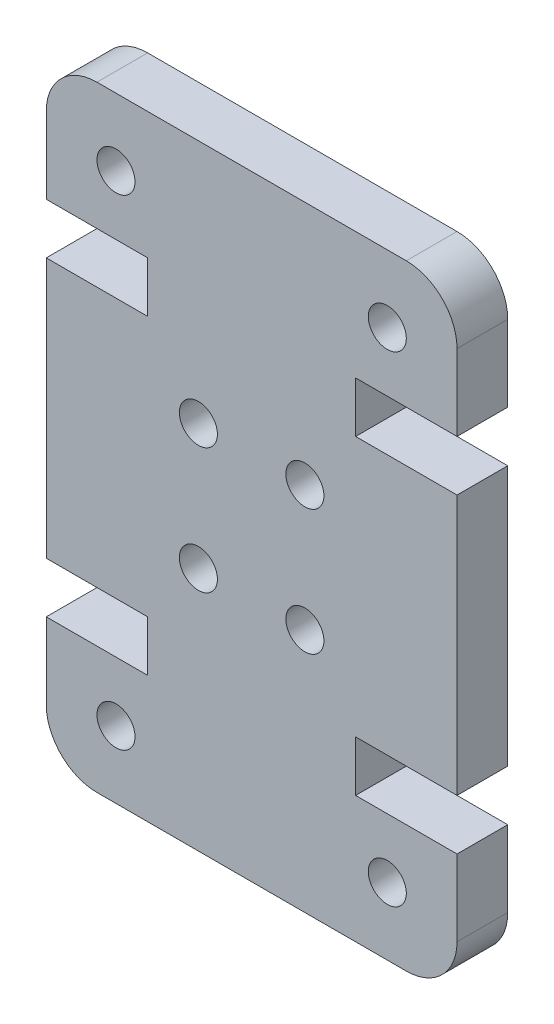
ISO-10303-21;
HEADER;
FILE_DESCRIPTION(('STEP AP214'),'2;1');
FILE_NAME('part.step','',(''),(''),'','','');
FILE_SCHEMA(('AUTOMOTIVE_DESIGN { 1 0 10303 214 1 1 1 1 }'));
ENDSEC;
DATA;
#1=APPLICATION_CONTEXT('core data for automotive mechanical design processes');
#2=APPLICATION_PROTOCOL_DEFINITION('international standard','automotive_design',2000,#1);
#3=PRODUCT_CONTEXT('',#1,'mechanical');
#4=PRODUCT('Part','Part','',(#3));
#5=PRODUCT_RELATED_PRODUCT_CATEGORY('part','',(#4));
#6=PRODUCT_DEFINITION_FORMATION('','',#4);
#7=PRODUCT_DEFINITION_CONTEXT('part definition',#1,'design');
#8=PRODUCT_DEFINITION('design','',#6,#7);
#9=PRODUCT_DEFINITION_SHAPE('','',#8);
#10=(LENGTH_UNIT() NAMED_UNIT(*) SI_UNIT(.MILLI.,.METRE.));
#11=(NAMED_UNIT(*) PLANE_ANGLE_UNIT() SI_UNIT($,.RADIAN.));
#12=(NAMED_UNIT(*) SI_UNIT($,.STERADIAN.) SOLID_ANGLE_UNIT());
#13=UNCERTAINTY_MEASURE_WITH_UNIT(LENGTH_MEASURE(1.E-05),#10,'distance_accuracy_value','');
#14=(GEOMETRIC_REPRESENTATION_CONTEXT(3) GLOBAL_UNCERTAINTY_ASSIGNED_CONTEXT((#13)) GLOBAL_UNIT_ASSIGNED_CONTEXT((#10,
#11,#12)) REPRESENTATION_CONTEXT('',''));
#15=CARTESIAN_POINT('',(0.,0.,0.));
#16=DIRECTION('',(0.,0.,1.));
#17=DIRECTION('',(1.,0.,0.));
#18=AXIS2_PLACEMENT_3D('',#15,#16,#17);
#19=CARTESIAN_POINT('',(14.2,2.,2.));
#20=DIRECTION('',(0.,0.,-1.));
#21=DIRECTION('',(-1.,0.,0.));
#22=AXIS2_PLACEMENT_3D('',#19,#20,#21);
#23=PLANE('',#22);
#24=CARTESIAN_POINT('',(6.00000000000001,9.65355116894447,2.));
#25=DIRECTION('',(0.,0.,1.));
#26=DIRECTION('',(1.,0.,0.));
#27=AXIS2_PLACEMENT_3D('',#24,#25,#26);
#28=CIRCLE('',#27,0.749999999999999);
#29=CARTESIAN_POINT('',(6.75,9.65355116894447,2.));
#30=VERTEX_POINT('',#29);
#31=EDGE_CURVE('E464',#30,#30,#28,.T.);
#32=ORIENTED_EDGE('',*,*,#31,.F.);
#33=EDGE_LOOP('',(#32));
#34=FACE_BOUND('',#33,.T.);
#35=CARTESIAN_POINT('',(10.2,14.6064488310555,2.));
#36=DIRECTION('',(0.,0.,1.));
#37=DIRECTION('',(1.,0.,0.));
#38=AXIS2_PLACEMENT_3D('',#35,#36,#37);
#39=CIRCLE('',#38,0.749999999999998);
#40=CARTESIAN_POINT('',(10.95,14.6064488310555,2.));
#41=VERTEX_POINT('',#40);
#42=EDGE_CURVE('E476',#41,#41,#39,.T.);
#43=ORIENTED_EDGE('',*,*,#42,.F.);
#44=EDGE_LOOP('',(#43));
#45=FACE_BOUND('',#44,.T.);
#46=CARTESIAN_POINT('',(2.75000000000003,21.606448831055,2.));
#47=DIRECTION('',(0.,0.,1.));
#48=DIRECTION('',(-1.,0.,0.));
#49=AXIS2_PLACEMENT_3D('',#46,#47,#48);
#50=CIRCLE('',#49,0.749999999999999);
#51=CARTESIAN_POINT('',(2.00000000000003,21.606448831055,2.));
#52=VERTEX_POINT('',#51);
#53=EDGE_CURVE('E488',#52,#52,#50,.T.);
#54=ORIENTED_EDGE('',*,*,#53,.F.);
#55=EDGE_LOOP('',(#54));
#56=FACE_BOUND('',#55,.T.);
#57=CARTESIAN_POINT('',(13.45,2.65355116894501,2.));
#58=DIRECTION('',(0.,0.,1.));
#59=DIRECTION('',(-1.,0.,0.));
#60=AXIS2_PLACEMENT_3D('',#57,#58,#59);
#61=CIRCLE('',#60,0.75);
#62=CARTESIAN_POINT('',(12.7,2.65355116894501,2.));
#63=VERTEX_POINT('',#62);
#64=EDGE_CURVE('E230',#63,#63,#61,.T.);
#65=ORIENTED_EDGE('',*,*,#64,.F.);
#66=EDGE_LOOP('',(#65));
#67=FACE_BOUND('',#66,.T.);
#68=CARTESIAN_POINT('',(14.2,2.,2.));
#69=DIRECTION('',(0.,0.,1.));
#70=DIRECTION('',(-1.,0.,0.));
#71=AXIS2_PLACEMENT_3D('',#68,#69,#70);
#72=CIRCLE('',#71,2.);
#73=CARTESIAN_POINT('',(14.2,0.,2.));
#74=VERTEX_POINT('',#73);
#75=CARTESIAN_POINT('',(16.2,2.,2.));
#76=VERTEX_POINT('',#75);
#77=EDGE_CURVE('E273',#74,#76,#72,.T.);
#78=ORIENTED_EDGE('',*,*,#77,.T.);
#79=DIRECTION('',(0.,1.,0.));
#80=VECTOR('',#79,1.);
#81=CARTESIAN_POINT('',(16.2,2.,2.));
#82=LINE('',#81,#80);
#83=CARTESIAN_POINT('',(16.2,4.99999999999945,2.));
#84=VERTEX_POINT('',#83);
#85=EDGE_CURVE('E141',#76,#84,#82,.T.);
#86=ORIENTED_EDGE('',*,*,#85,.T.);
#87=DIRECTION('',(-1.,0.,0.));
#88=VECTOR('',#87,1.);
#89=CARTESIAN_POINT('',(12.2,4.99999999999945,2.));
#90=LINE('',#89,#88);
#91=CARTESIAN_POINT('',(12.2,4.99999999999945,2.));
#92=VERTEX_POINT('',#91);
#93=EDGE_CURVE('E336',#84,#92,#90,.T.);
#94=ORIENTED_EDGE('',*,*,#93,.T.);
#95=DIRECTION('',(0.,1.,0.));
#96=VECTOR('',#95,1.);
#97=CARTESIAN_POINT('',(12.2,6.99999999999945,2.));
#98=LINE('',#97,#96);
#99=CARTESIAN_POINT('',(12.2,6.99999999999945,2.));
#100=VERTEX_POINT('',#99);
#101=EDGE_CURVE('E355',#92,#100,#98,.T.);
#102=ORIENTED_EDGE('',*,*,#101,.T.);
#103=DIRECTION('',(1.,0.,0.));
#104=VECTOR('',#103,1.);
#105=CARTESIAN_POINT('',(16.2,6.99999999999945,2.));
#106=LINE('',#105,#104);
#107=CARTESIAN_POINT('',(16.2,6.99999999999945,2.));
#108=VERTEX_POINT('',#107);
#109=EDGE_CURVE('E352',#100,#108,#106,.T.);
#110=ORIENTED_EDGE('',*,*,#109,.T.);
#111=DIRECTION('',(0.,1.,0.));
#112=VECTOR('',#111,1.);
#113=CARTESIAN_POINT('',(16.2,17.2600000000005,2.));
#114=LINE('',#113,#112);
#115=CARTESIAN_POINT('',(16.2,17.2600000000005,2.));
#116=VERTEX_POINT('',#115);
#117=EDGE_CURVE('E354',#108,#116,#114,.T.);
#118=ORIENTED_EDGE('',*,*,#117,.T.);
#119=DIRECTION('',(-1.,0.,0.));
#120=VECTOR('',#119,1.);
#121=CARTESIAN_POINT('',(16.2,17.2600000000005,2.));
#122=LINE('',#121,#120);
#123=CARTESIAN_POINT('',(12.2,17.2600000000005,2.));
#124=VERTEX_POINT('',#123);
#125=EDGE_CURVE('E357',#116,#124,#122,.T.);
#126=ORIENTED_EDGE('',*,*,#125,.T.);
#127=DIRECTION('',(0.,1.,0.));
#128=VECTOR('',#127,1.);
#129=CARTESIAN_POINT('',(12.2,17.2600000000005,2.));
#130=LINE('',#129,#128);
#131=CARTESIAN_POINT('',(12.2,19.2600000000005,2.));
#132=VERTEX_POINT('',#131);
#133=EDGE_CURVE('E363',#124,#132,#130,.T.);
#134=ORIENTED_EDGE('',*,*,#133,.T.);
#135=DIRECTION('',(1.,0.,0.));
#136=VECTOR('',#135,1.);
#137=CARTESIAN_POINT('',(12.2,19.2600000000005,2.));
#138=LINE('',#137,#136);
#139=CARTESIAN_POINT('',(16.2,19.2600000000005,2.));
#140=VERTEX_POINT('',#139);
#141=EDGE_CURVE('E365',#132,#140,#138,.T.);
#142=ORIENTED_EDGE('',*,*,#141,.T.);
#143=DIRECTION('',(0.,1.,0.));
#144=VECTOR('',#143,1.);
#145=CARTESIAN_POINT('',(16.2,22.26,2.));
#146=LINE('',#145,#144);
#147=CARTESIAN_POINT('',(16.2,22.26,2.));
#148=VERTEX_POINT('',#147);
#149=EDGE_CURVE('E367',#140,#148,#146,.T.);
#150=ORIENTED_EDGE('',*,*,#149,.T.);
#151=CARTESIAN_POINT('',(14.2,22.26,2.));
#152=DIRECTION('',(0.,0.,1.));
#153=DIRECTION('',(1.,0.,0.));
#154=AXIS2_PLACEMENT_3D('',#151,#152,#153);
#155=CIRCLE('',#154,2.);
#156=CARTESIAN_POINT('',(14.2,24.26,2.));
#157=VERTEX_POINT('',#156);
#158=EDGE_CURVE('E369',#148,#157,#155,.T.);
#159=ORIENTED_EDGE('',*,*,#158,.T.);
#160=DIRECTION('',(-1.,0.,0.));
#161=VECTOR('',#160,1.);
#162=CARTESIAN_POINT('',(1.99999999999999,24.26,2.));
#163=LINE('',#162,#161);
#164=CARTESIAN_POINT('',(1.99999999999999,24.26,2.));
#165=VERTEX_POINT('',#164);
#166=EDGE_CURVE('E371',#157,#165,#163,.T.);
#167=ORIENTED_EDGE('',*,*,#166,.T.);
#168=CARTESIAN_POINT('',(2.,22.26,2.));
#169=DIRECTION('',(0.,0.,1.));
#170=DIRECTION('',(-1.,0.,0.));
#171=AXIS2_PLACEMENT_3D('',#168,#169,#170);
#172=CIRCLE('',#171,2.);
#173=CARTESIAN_POINT('',(0.,22.26,2.));
#174=VERTEX_POINT('',#173);
#175=EDGE_CURVE('E373',#165,#174,#172,.T.);
#176=ORIENTED_EDGE('',*,*,#175,.T.);
#177=DIRECTION('',(0.,-1.,0.));
#178=VECTOR('',#177,1.);
#179=CARTESIAN_POINT('',(0.,22.26,2.));
#180=LINE('',#179,#178);
#181=CARTESIAN_POINT('',(0.,19.2600000000005,2.));
#182=VERTEX_POINT('',#181);
#183=EDGE_CURVE('E375',#174,#182,#180,.T.);
#184=ORIENTED_EDGE('',*,*,#183,.T.);
#185=DIRECTION('',(1.,0.,0.));
#186=VECTOR('',#185,1.);
#187=CARTESIAN_POINT('',(3.99999999999999,19.2600000000005,2.));
#188=LINE('',#187,#186);
#189=CARTESIAN_POINT('',(3.99999999999999,19.2600000000005,2.));
#190=VERTEX_POINT('',#189);
#191=EDGE_CURVE('E377',#182,#190,#188,.T.);
#192=ORIENTED_EDGE('',*,*,#191,.T.);
#193=DIRECTION('',(0.,-1.,0.));
#194=VECTOR('',#193,1.);
#195=CARTESIAN_POINT('',(3.99999999999999,17.2600000000005,2.));
#196=LINE('',#195,#194);
#197=CARTESIAN_POINT('',(3.99999999999999,17.2600000000005,2.));
#198=VERTEX_POINT('',#197);
#199=EDGE_CURVE('E379',#190,#198,#196,.T.);
#200=ORIENTED_EDGE('',*,*,#199,.T.);
#201=DIRECTION('',(-1.,0.,0.));
#202=VECTOR('',#201,1.);
#203=CARTESIAN_POINT('',(0.,17.2600000000005,2.));
#204=LINE('',#203,#202);
#205=CARTESIAN_POINT('',(0.,17.2600000000005,2.));
#206=VERTEX_POINT('',#205);
#207=EDGE_CURVE('E381',#198,#206,#204,.T.);
#208=ORIENTED_EDGE('',*,*,#207,.T.);
#209=DIRECTION('',(0.,-1.,0.));
#210=VECTOR('',#209,1.);
#211=CARTESIAN_POINT('',(0.,17.2600000000005,2.));
#212=LINE('',#211,#210);
#213=CARTESIAN_POINT('',(0.,6.99999999999945,2.));
#214=VERTEX_POINT('',#213);
#215=EDGE_CURVE('E383',#206,#214,#212,.T.);
#216=ORIENTED_EDGE('',*,*,#215,.T.);
#217=DIRECTION('',(1.,0.,0.));
#218=VECTOR('',#217,1.);
#219=CARTESIAN_POINT('',(0.,6.99999999999945,2.));
#220=LINE('',#219,#218);
#221=CARTESIAN_POINT('',(4.,6.99999999999945,2.));
#222=VERTEX_POINT('',#221);
#223=EDGE_CURVE('E385',#214,#222,#220,.T.);
#224=ORIENTED_EDGE('',*,*,#223,.T.);
#225=DIRECTION('',(0.,-1.,0.));
#226=VECTOR('',#225,1.);
#227=CARTESIAN_POINT('',(4.,6.99999999999945,2.));
#228=LINE('',#227,#226);
#229=CARTESIAN_POINT('',(4.,4.99999999999945,2.));
#230=VERTEX_POINT('',#229);
#231=EDGE_CURVE('E387',#222,#230,#228,.T.);
#232=ORIENTED_EDGE('',*,*,#231,.T.);
#233=DIRECTION('',(-1.,0.,0.));
#234=VECTOR('',#233,1.);
#235=CARTESIAN_POINT('',(4.,4.99999999999945,2.));
#236=LINE('',#235,#234);
#237=CARTESIAN_POINT('',(0.,4.99999999999945,2.));
#238=VERTEX_POINT('',#237);
#239=EDGE_CURVE('E208',#230,#238,#236,.T.);
#240=ORIENTED_EDGE('',*,*,#239,.T.);
#241=DIRECTION('',(0.,-1.,0.));
#242=VECTOR('',#241,1.);
#243=CARTESIAN_POINT('',(0.,2.,2.));
#244=LINE('',#243,#242);
#245=CARTESIAN_POINT('',(0.,2.,2.));
#246=VERTEX_POINT('',#245);
#247=EDGE_CURVE('E202',#238,#246,#244,.T.);
#248=ORIENTED_EDGE('',*,*,#247,.T.);
#249=CARTESIAN_POINT('',(2.,2.,2.));
#250=DIRECTION('',(0.,0.,1.));
#251=DIRECTION('',(1.,0.,0.));
#252=AXIS2_PLACEMENT_3D('',#249,#250,#251);
#253=CIRCLE('',#252,2.);
#254=CARTESIAN_POINT('',(2.,0.,2.));
#255=VERTEX_POINT('',#254);
#256=EDGE_CURVE('E206',#246,#255,#253,.T.);
#257=ORIENTED_EDGE('',*,*,#256,.T.);
#258=DIRECTION('',(1.,0.,0.));
#259=VECTOR('',#258,1.);
#260=CARTESIAN_POINT('',(2.,0.,2.));
#261=LINE('',#260,#259);
#262=EDGE_CURVE('E50',#255,#74,#261,.T.);
#263=ORIENTED_EDGE('',*,*,#262,.T.);
#264=EDGE_LOOP('',(#78,#86,#94,#102,#110,#118,#126,#134,#142,#150,#159,#167,#176,#184,#192,#200,
#208,#216,#224,#232,#240,#248,#257,#263));
#265=FACE_BOUND('',#264,.T.);
#266=CARTESIAN_POINT('',(10.2,9.65355116894447,2.));
#267=DIRECTION('',(0.,0.,1.));
#268=DIRECTION('',(-1.,0.,0.));
#269=AXIS2_PLACEMENT_3D('',#266,#267,#268);
#270=CIRCLE('',#269,0.749999999999998);
#271=CARTESIAN_POINT('',(9.44999999999999,9.65355116894447,2.));
#272=VERTEX_POINT('',#271);
#273=EDGE_CURVE('E494',#272,#272,#270,.T.);
#274=ORIENTED_EDGE('',*,*,#273,.F.);
#275=EDGE_LOOP('',(#274));
#276=FACE_BOUND('',#275,.T.);
#277=CARTESIAN_POINT('',(6.,14.6064488310555,2.));
#278=DIRECTION('',(0.,0.,1.));
#279=DIRECTION('',(-1.,0.,0.));
#280=AXIS2_PLACEMENT_3D('',#277,#278,#279);
#281=CIRCLE('',#280,0.75);
#282=CARTESIAN_POINT('',(5.25,14.6064488310555,2.));
#283=VERTEX_POINT('',#282);
#284=EDGE_CURVE('E482',#283,#283,#281,.T.);
#285=ORIENTED_EDGE('',*,*,#284,.F.);
#286=EDGE_LOOP('',(#285));
#287=FACE_BOUND('',#286,.T.);
#288=CARTESIAN_POINT('',(13.45,21.606448831055,2.));
#289=DIRECTION('',(0.,0.,1.));
#290=DIRECTION('',(1.,0.,0.));
#291=AXIS2_PLACEMENT_3D('',#288,#289,#290);
#292=CIRCLE('',#291,0.75);
#293=CARTESIAN_POINT('',(14.2,21.606448831055,2.));
#294=VERTEX_POINT('',#293);
#295=EDGE_CURVE('E470',#294,#294,#292,.T.);
#296=ORIENTED_EDGE('',*,*,#295,.F.);
#297=EDGE_LOOP('',(#296));
#298=FACE_BOUND('',#297,.T.);
#299=CARTESIAN_POINT('',(2.75000000000003,2.65355116894501,2.));
#300=DIRECTION('',(0.,0.,1.));
#301=DIRECTION('',(1.,0.,0.));
#302=AXIS2_PLACEMENT_3D('',#299,#300,#301);
#303=CIRCLE('',#302,0.749999999999999);
#304=CARTESIAN_POINT('',(3.50000000000003,2.65355116894501,2.));
#305=VERTEX_POINT('',#304);
#306=EDGE_CURVE('E455',#305,#305,#303,.T.);
#307=ORIENTED_EDGE('',*,*,#306,.F.);
#308=EDGE_LOOP('',(#307));
#309=FACE_BOUND('',#308,.T.);
#310=ADVANCED_FACE('F33',(#34,#45,#56,#67,#265,#276,#287,#298,#309),#23,.F.);
#311=CARTESIAN_POINT('',(14.2,2.,0.));
#312=DIRECTION('',(0.,0.,-1.));
#313=DIRECTION('',(-1.,0.,0.));
#314=AXIS2_PLACEMENT_3D('',#311,#312,#313);
#315=PLANE('',#314);
#316=CARTESIAN_POINT('',(6.00000000000001,9.65355116894447,0.));
#317=DIRECTION('',(0.,0.,1.));
#318=DIRECTION('',(1.,0.,0.));
#319=AXIS2_PLACEMENT_3D('',#316,#317,#318);
#320=CIRCLE('',#319,0.749999999999999);
#321=CARTESIAN_POINT('',(6.75,9.65355116894447,0.));
#322=VERTEX_POINT('',#321);
#323=EDGE_CURVE('E461',#322,#322,#320,.T.);
#324=ORIENTED_EDGE('',*,*,#323,.T.);
#325=EDGE_LOOP('',(#324));
#326=FACE_BOUND('',#325,.T.);
#327=CARTESIAN_POINT('',(10.2,14.6064488310555,0.));
#328=DIRECTION('',(0.,0.,1.));
#329=DIRECTION('',(1.,0.,0.));
#330=AXIS2_PLACEMENT_3D('',#327,#328,#329);
#331=CIRCLE('',#330,0.749999999999998);
#332=CARTESIAN_POINT('',(10.95,14.6064488310555,0.));
#333=VERTEX_POINT('',#332);
#334=EDGE_CURVE('E473',#333,#333,#331,.T.);
#335=ORIENTED_EDGE('',*,*,#334,.T.);
#336=EDGE_LOOP('',(#335));
#337=FACE_BOUND('',#336,.T.);
#338=CARTESIAN_POINT('',(2.75000000000003,21.606448831055,0.));
#339=DIRECTION('',(0.,0.,1.));
#340=DIRECTION('',(-1.,0.,0.));
#341=AXIS2_PLACEMENT_3D('',#338,#339,#340);
#342=CIRCLE('',#341,0.749999999999999);
#343=CARTESIAN_POINT('',(2.00000000000003,21.606448831055,0.));
#344=VERTEX_POINT('',#343);
#345=EDGE_CURVE('E485',#344,#344,#342,.T.);
#346=ORIENTED_EDGE('',*,*,#345,.T.);
#347=EDGE_LOOP('',(#346));
#348=FACE_BOUND('',#347,.T.);
#349=CARTESIAN_POINT('',(13.45,2.65355116894501,0.));
#350=DIRECTION('',(0.,0.,1.));
#351=DIRECTION('',(-1.,0.,0.));
#352=AXIS2_PLACEMENT_3D('',#349,#350,#351);
#353=CIRCLE('',#352,0.75);
#354=CARTESIAN_POINT('',(12.7,2.65355116894501,0.));
#355=VERTEX_POINT('',#354);
#356=EDGE_CURVE('E497',#355,#355,#353,.T.);
#357=ORIENTED_EDGE('',*,*,#356,.T.);
#358=EDGE_LOOP('',(#357));
#359=FACE_BOUND('',#358,.T.);
#360=CARTESIAN_POINT('',(14.2,2.,0.));
#361=DIRECTION('',(0.,0.,1.));
#362=DIRECTION('',(-1.,0.,0.));
#363=AXIS2_PLACEMENT_3D('',#360,#361,#362);
#364=CIRCLE('',#363,2.);
#365=CARTESIAN_POINT('',(14.2,0.,0.));
#366=VERTEX_POINT('',#365);
#367=CARTESIAN_POINT('',(16.2,2.,0.));
#368=VERTEX_POINT('',#367);
#369=EDGE_CURVE('E226',#366,#368,#364,.T.);
#370=ORIENTED_EDGE('',*,*,#369,.F.);
#371=DIRECTION('',(1.,0.,0.));
#372=VECTOR('',#371,1.);
#373=CARTESIAN_POINT('',(2.,0.,0.));
#374=LINE('',#373,#372);
#375=CARTESIAN_POINT('',(2.,0.,0.));
#376=VERTEX_POINT('',#375);
#377=EDGE_CURVE('E133',#376,#366,#374,.T.);
#378=ORIENTED_EDGE('',*,*,#377,.F.);
#379=CARTESIAN_POINT('',(2.,2.,0.));
#380=DIRECTION('',(0.,0.,1.));
#381=DIRECTION('',(1.,0.,0.));
#382=AXIS2_PLACEMENT_3D('',#379,#380,#381);
#383=CIRCLE('',#382,2.);
#384=CARTESIAN_POINT('',(0.,2.,0.));
#385=VERTEX_POINT('',#384);
#386=EDGE_CURVE('E127',#385,#376,#383,.T.);
#387=ORIENTED_EDGE('',*,*,#386,.F.);
#388=DIRECTION('',(0.,-1.,0.));
#389=VECTOR('',#388,1.);
#390=CARTESIAN_POINT('',(0.,2.,0.));
#391=LINE('',#390,#389);
#392=CARTESIAN_POINT('',(0.,4.99999999999945,0.));
#393=VERTEX_POINT('',#392);
#394=EDGE_CURVE('E216',#393,#385,#391,.T.);
#395=ORIENTED_EDGE('',*,*,#394,.F.);
#396=DIRECTION('',(-1.,0.,0.));
#397=VECTOR('',#396,1.);
#398=CARTESIAN_POINT('',(4.,4.99999999999945,0.));
#399=LINE('',#398,#397);
#400=CARTESIAN_POINT('',(4.,4.99999999999945,0.));
#401=VERTEX_POINT('',#400);
#402=EDGE_CURVE('E268',#401,#393,#399,.T.);
#403=ORIENTED_EDGE('',*,*,#402,.F.);
#404=DIRECTION('',(0.,-1.,0.));
#405=VECTOR('',#404,1.);
#406=CARTESIAN_POINT('',(4.,6.99999999999945,0.));
#407=LINE('',#406,#405);
#408=CARTESIAN_POINT('',(4.,6.99999999999945,0.));
#409=VERTEX_POINT('',#408);
#410=EDGE_CURVE('E266',#409,#401,#407,.T.);
#411=ORIENTED_EDGE('',*,*,#410,.F.);
#412=DIRECTION('',(1.,0.,0.));
#413=VECTOR('',#412,1.);
#414=CARTESIAN_POINT('',(0.,6.99999999999945,0.));
#415=LINE('',#414,#413);
#416=CARTESIAN_POINT('',(0.,6.99999999999945,0.));
#417=VERTEX_POINT('',#416);
#418=EDGE_CURVE('E264',#417,#409,#415,.T.);
#419=ORIENTED_EDGE('',*,*,#418,.F.);
#420=DIRECTION('',(0.,-1.,0.));
#421=VECTOR('',#420,1.);
#422=CARTESIAN_POINT('',(0.,17.2600000000005,0.));
#423=LINE('',#422,#421);
#424=CARTESIAN_POINT('',(0.,17.2600000000005,0.));
#425=VERTEX_POINT('',#424);
#426=EDGE_CURVE('E262',#425,#417,#423,.T.);
#427=ORIENTED_EDGE('',*,*,#426,.F.);
#428=DIRECTION('',(-1.,0.,0.));
#429=VECTOR('',#428,1.);
#430=CARTESIAN_POINT('',(0.,17.2600000000005,0.));
#431=LINE('',#430,#429);
#432=CARTESIAN_POINT('',(3.99999999999999,17.2600000000005,0.));
#433=VERTEX_POINT('',#432);
#434=EDGE_CURVE('E260',#433,#425,#431,.T.);
#435=ORIENTED_EDGE('',*,*,#434,.F.);
#436=DIRECTION('',(0.,-1.,0.));
#437=VECTOR('',#436,1.);
#438=CARTESIAN_POINT('',(3.99999999999999,17.2600000000005,0.));
#439=LINE('',#438,#437);
#440=CARTESIAN_POINT('',(3.99999999999999,19.2600000000005,0.));
#441=VERTEX_POINT('',#440);
#442=EDGE_CURVE('E258',#441,#433,#439,.T.);
#443=ORIENTED_EDGE('',*,*,#442,.F.);
#444=DIRECTION('',(1.,0.,0.));
#445=VECTOR('',#444,1.);
#446=CARTESIAN_POINT('',(3.99999999999999,19.2600000000005,0.));
#447=LINE('',#446,#445);
#448=CARTESIAN_POINT('',(0.,19.2600000000005,0.));
#449=VERTEX_POINT('',#448);
#450=EDGE_CURVE('E256',#449,#441,#447,.T.);
#451=ORIENTED_EDGE('',*,*,#450,.F.);
#452=DIRECTION('',(0.,-1.,0.));
#453=VECTOR('',#452,1.);
#454=CARTESIAN_POINT('',(0.,22.26,0.));
#455=LINE('',#454,#453);
#456=CARTESIAN_POINT('',(0.,22.26,0.));
#457=VERTEX_POINT('',#456);
#458=EDGE_CURVE('E254',#457,#449,#455,.T.);
#459=ORIENTED_EDGE('',*,*,#458,.F.);
#460=CARTESIAN_POINT('',(2.,22.26,0.));
#461=DIRECTION('',(0.,0.,1.));
#462=DIRECTION('',(-1.,0.,0.));
#463=AXIS2_PLACEMENT_3D('',#460,#461,#462);
#464=CIRCLE('',#463,2.);
#465=CARTESIAN_POINT('',(1.99999999999999,24.26,0.));
#466=VERTEX_POINT('',#465);
#467=EDGE_CURVE('E252',#466,#457,#464,.T.);
#468=ORIENTED_EDGE('',*,*,#467,.F.);
#469=DIRECTION('',(-1.,0.,0.));
#470=VECTOR('',#469,1.);
#471=CARTESIAN_POINT('',(1.99999999999999,24.26,0.));
#472=LINE('',#471,#470);
#473=CARTESIAN_POINT('',(14.2,24.26,0.));
#474=VERTEX_POINT('',#473);
#475=EDGE_CURVE('E250',#474,#466,#472,.T.);
#476=ORIENTED_EDGE('',*,*,#475,.F.);
#477=CARTESIAN_POINT('',(14.2,22.26,0.));
#478=DIRECTION('',(0.,0.,1.));
#479=DIRECTION('',(1.,0.,0.));
#480=AXIS2_PLACEMENT_3D('',#477,#478,#479);
#481=CIRCLE('',#480,2.);
#482=CARTESIAN_POINT('',(16.2,22.26,0.));
#483=VERTEX_POINT('',#482);
#484=EDGE_CURVE('E248',#483,#474,#481,.T.);
#485=ORIENTED_EDGE('',*,*,#484,.F.);
#486=DIRECTION('',(0.,1.,0.));
#487=VECTOR('',#486,1.);
#488=CARTESIAN_POINT('',(16.2,22.26,0.));
#489=LINE('',#488,#487);
#490=CARTESIAN_POINT('',(16.2,19.2600000000005,0.));
#491=VERTEX_POINT('',#490);
#492=EDGE_CURVE('E246',#491,#483,#489,.T.);
#493=ORIENTED_EDGE('',*,*,#492,.F.);
#494=DIRECTION('',(1.,0.,0.));
#495=VECTOR('',#494,1.);
#496=CARTESIAN_POINT('',(12.2,19.2600000000005,0.));
#497=LINE('',#496,#495);
#498=CARTESIAN_POINT('',(12.2,19.2600000000005,0.));
#499=VERTEX_POINT('',#498);
#500=EDGE_CURVE('E244',#499,#491,#497,.T.);
#501=ORIENTED_EDGE('',*,*,#500,.F.);
#502=DIRECTION('',(0.,1.,0.));
#503=VECTOR('',#502,1.);
#504=CARTESIAN_POINT('',(12.2,17.2600000000005,0.));
#505=LINE('',#504,#503);
#506=CARTESIAN_POINT('',(12.2,17.2600000000005,0.));
#507=VERTEX_POINT('',#506);
#508=EDGE_CURVE('E242',#507,#499,#505,.T.);
#509=ORIENTED_EDGE('',*,*,#508,.F.);
#510=DIRECTION('',(-1.,0.,0.));
#511=VECTOR('',#510,1.);
#512=CARTESIAN_POINT('',(16.2,17.2600000000005,0.));
#513=LINE('',#512,#511);
#514=CARTESIAN_POINT('',(16.2,17.2600000000005,0.));
#515=VERTEX_POINT('',#514);
#516=EDGE_CURVE('E240',#515,#507,#513,.T.);
#517=ORIENTED_EDGE('',*,*,#516,.F.);
#518=DIRECTION('',(0.,1.,0.));
#519=VECTOR('',#518,1.);
#520=CARTESIAN_POINT('',(16.2,17.2600000000005,0.));
#521=LINE('',#520,#519);
#522=CARTESIAN_POINT('',(16.2,6.99999999999945,0.));
#523=VERTEX_POINT('',#522);
#524=EDGE_CURVE('E238',#523,#515,#521,.T.);
#525=ORIENTED_EDGE('',*,*,#524,.F.);
#526=DIRECTION('',(1.,0.,0.));
#527=VECTOR('',#526,1.);
#528=CARTESIAN_POINT('',(16.2,6.99999999999945,0.));
#529=LINE('',#528,#527);
#530=CARTESIAN_POINT('',(12.2,6.99999999999945,0.));
#531=VERTEX_POINT('',#530);
#532=EDGE_CURVE('E236',#531,#523,#529,.T.);
#533=ORIENTED_EDGE('',*,*,#532,.F.);
#534=DIRECTION('',(0.,1.,0.));
#535=VECTOR('',#534,1.);
#536=CARTESIAN_POINT('',(12.2,6.99999999999945,0.));
#537=LINE('',#536,#535);
#538=CARTESIAN_POINT('',(12.2,4.99999999999945,0.));
#539=VERTEX_POINT('',#538);
#540=EDGE_CURVE('E234',#539,#531,#537,.T.);
#541=ORIENTED_EDGE('',*,*,#540,.F.);
#542=DIRECTION('',(-1.,0.,0.));
#543=VECTOR('',#542,1.);
#544=CARTESIAN_POINT('',(12.2,4.99999999999945,0.));
#545=LINE('',#544,#543);
#546=CARTESIAN_POINT('',(16.2,4.99999999999945,0.));
#547=VERTEX_POINT('',#546);
#548=EDGE_CURVE('E232',#547,#539,#545,.T.);
#549=ORIENTED_EDGE('',*,*,#548,.F.);
#550=DIRECTION('',(0.,1.,0.));
#551=VECTOR('',#550,1.);
#552=CARTESIAN_POINT('',(16.2,2.,0.));
#553=LINE('',#552,#551);
#554=EDGE_CURVE('E229',#368,#547,#553,.T.);
#555=ORIENTED_EDGE('',*,*,#554,.F.);
#556=EDGE_LOOP('',(#370,#378,#387,#395,#403,#411,#419,#427,#435,#443,#451,#459,#468,#476,#485,
#493,#501,#509,#517,#525,#533,#541,#549,#555));
#557=FACE_BOUND('',#556,.T.);
#558=CARTESIAN_POINT('',(10.2,9.65355116894447,0.));
#559=DIRECTION('',(0.,0.,1.));
#560=DIRECTION('',(-1.,0.,0.));
#561=AXIS2_PLACEMENT_3D('',#558,#559,#560);
#562=CIRCLE('',#561,0.749999999999998);
#563=CARTESIAN_POINT('',(9.44999999999999,9.65355116894447,0.));
#564=VERTEX_POINT('',#563);
#565=EDGE_CURVE('E491',#564,#564,#562,.T.);
#566=ORIENTED_EDGE('',*,*,#565,.T.);
#567=EDGE_LOOP('',(#566));
#568=FACE_BOUND('',#567,.T.);
#569=CARTESIAN_POINT('',(6.,14.6064488310555,0.));
#570=DIRECTION('',(0.,0.,1.));
#571=DIRECTION('',(-1.,0.,0.));
#572=AXIS2_PLACEMENT_3D('',#569,#570,#571);
#573=CIRCLE('',#572,0.75);
#574=CARTESIAN_POINT('',(5.25,14.6064488310555,0.));
#575=VERTEX_POINT('',#574);
#576=EDGE_CURVE('E479',#575,#575,#573,.T.);
#577=ORIENTED_EDGE('',*,*,#576,.T.);
#578=EDGE_LOOP('',(#577));
#579=FACE_BOUND('',#578,.T.);
#580=CARTESIAN_POINT('',(13.45,21.606448831055,0.));
#581=DIRECTION('',(0.,0.,1.));
#582=DIRECTION('',(1.,0.,0.));
#583=AXIS2_PLACEMENT_3D('',#580,#581,#582);
#584=CIRCLE('',#583,0.75);
#585=CARTESIAN_POINT('',(14.2,21.606448831055,0.));
#586=VERTEX_POINT('',#585);
#587=EDGE_CURVE('E467',#586,#586,#584,.T.);
#588=ORIENTED_EDGE('',*,*,#587,.T.);
#589=EDGE_LOOP('',(#588));
#590=FACE_BOUND('',#589,.T.);
#591=CARTESIAN_POINT('',(2.75000000000003,2.65355116894501,0.));
#592=DIRECTION('',(0.,0.,1.));
#593=DIRECTION('',(1.,0.,0.));
#594=AXIS2_PLACEMENT_3D('',#591,#592,#593);
#595=CIRCLE('',#594,0.749999999999999);
#596=CARTESIAN_POINT('',(3.50000000000003,2.65355116894501,0.));
#597=VERTEX_POINT('',#596);
#598=EDGE_CURVE('E458',#597,#597,#595,.T.);
#599=ORIENTED_EDGE('',*,*,#598,.T.);
#600=EDGE_LOOP('',(#599));
#601=FACE_BOUND('',#600,.T.);
#602=ADVANCED_FACE('F340',(#326,#337,#348,#359,#557,#568,#579,#590,#601),#315,.T.);
#603=CARTESIAN_POINT('',(14.2,2.,2.));
#604=DIRECTION('',(0.,0.,-1.));
#605=DIRECTION('',(-1.,0.,0.));
#606=AXIS2_PLACEMENT_3D('',#603,#604,#605);
#607=CYLINDRICAL_SURFACE('',#606,2.);
#608=ORIENTED_EDGE('',*,*,#369,.T.);
#609=DIRECTION('',(0.,0.,-1.));
#610=VECTOR('',#609,1.);
#611=CARTESIAN_POINT('',(16.2,2.,2.));
#612=LINE('',#611,#610);
#613=EDGE_CURVE('E11',#76,#368,#612,.T.);
#614=ORIENTED_EDGE('',*,*,#613,.F.);
#615=ORIENTED_EDGE('',*,*,#77,.F.);
#616=DIRECTION('',(0.,0.,-1.));
#617=VECTOR('',#616,1.);
#618=CARTESIAN_POINT('',(14.2,0.,2.));
#619=LINE('',#618,#617);
#620=EDGE_CURVE('E222',#74,#366,#619,.T.);
#621=ORIENTED_EDGE('',*,*,#620,.T.);
#622=EDGE_LOOP('',(#608,#614,#615,#621));
#623=FACE_BOUND('',#622,.T.);
#624=ADVANCED_FACE('F35',(#623),#607,.T.);
#625=CARTESIAN_POINT('',(16.2,2.,2.));
#626=DIRECTION('',(-1.,0.,0.));
#627=DIRECTION('',(0.,0.,1.));
#628=AXIS2_PLACEMENT_3D('',#625,#626,#627);
#629=PLANE('',#628);
#630=ORIENTED_EDGE('',*,*,#554,.T.);
#631=DIRECTION('',(0.,0.,-1.));
#632=VECTOR('',#631,1.);
#633=CARTESIAN_POINT('',(16.2,4.99999999999945,2.));
#634=LINE('',#633,#632);
#635=EDGE_CURVE('E42',#84,#547,#634,.T.);
#636=ORIENTED_EDGE('',*,*,#635,.F.);
#637=ORIENTED_EDGE('',*,*,#85,.F.);
#638=ORIENTED_EDGE('',*,*,#613,.T.);
#639=EDGE_LOOP('',(#630,#636,#637,#638));
#640=FACE_BOUND('',#639,.T.);
#641=ADVANCED_FACE('F762',(#640),#629,.F.);
#642=CARTESIAN_POINT('',(12.2,4.99999999999945,2.));
#643=DIRECTION('',(0.,-1.,0.));
#644=DIRECTION('',(0.,0.,-1.));
#645=AXIS2_PLACEMENT_3D('',#642,#643,#644);
#646=PLANE('',#645);
#647=ORIENTED_EDGE('',*,*,#548,.T.);
#648=DIRECTION('',(0.,0.,-1.));
#649=VECTOR('',#648,1.);
#650=CARTESIAN_POINT('',(12.2,4.99999999999945,2.));
#651=LINE('',#650,#649);
#652=EDGE_CURVE('E328',#92,#539,#651,.T.);
#653=ORIENTED_EDGE('',*,*,#652,.F.);
#654=ORIENTED_EDGE('',*,*,#93,.F.);
#655=ORIENTED_EDGE('',*,*,#635,.T.);
#656=EDGE_LOOP('',(#647,#653,#654,#655));
#657=FACE_BOUND('',#656,.T.);
#658=ADVANCED_FACE('F334',(#657),#646,.F.);
#659=CARTESIAN_POINT('',(12.2,6.99999999999945,2.));
#660=DIRECTION('',(-1.,0.,0.));
#661=DIRECTION('',(0.,0.,1.));
#662=AXIS2_PLACEMENT_3D('',#659,#660,#661);
#663=PLANE('',#662);
#664=ORIENTED_EDGE('',*,*,#540,.T.);
#665=DIRECTION('',(0.,0.,-1.));
#666=VECTOR('',#665,1.);
#667=CARTESIAN_POINT('',(12.2,6.99999999999945,2.));
#668=LINE('',#667,#666);
#669=EDGE_CURVE('E325',#100,#531,#668,.T.);
#670=ORIENTED_EDGE('',*,*,#669,.F.);
#671=ORIENTED_EDGE('',*,*,#101,.F.);
#672=ORIENTED_EDGE('',*,*,#652,.T.);
#673=EDGE_LOOP('',(#664,#670,#671,#672));
#674=FACE_BOUND('',#673,.T.);
#675=ADVANCED_FACE('F346',(#674),#663,.F.);
#676=CARTESIAN_POINT('',(16.2,6.99999999999945,2.));
#677=DIRECTION('',(0.,1.,0.));
#678=DIRECTION('',(-1.,0.,0.));
#679=AXIS2_PLACEMENT_3D('',#676,#677,#678);
#680=PLANE('',#679);
#681=ORIENTED_EDGE('',*,*,#532,.T.);
#682=DIRECTION('',(0.,0.,-1.));
#683=VECTOR('',#682,1.);
#684=CARTESIAN_POINT('',(16.2,6.99999999999945,2.));
#685=LINE('',#684,#683);
#686=EDGE_CURVE('E322',#108,#523,#685,.T.);
#687=ORIENTED_EDGE('',*,*,#686,.F.);
#688=ORIENTED_EDGE('',*,*,#109,.F.);
#689=ORIENTED_EDGE('',*,*,#669,.T.);
#690=EDGE_LOOP('',(#681,#687,#688,#689));
#691=FACE_BOUND('',#690,.T.);
#692=ADVANCED_FACE('F350',(#691),#680,.F.);
#693=CARTESIAN_POINT('',(16.2,17.2600000000005,2.));
#694=DIRECTION('',(-1.,0.,0.));
#695=DIRECTION('',(0.,0.,1.));
#696=AXIS2_PLACEMENT_3D('',#693,#694,#695);
#697=PLANE('',#696);
#698=ORIENTED_EDGE('',*,*,#524,.T.);
#699=DIRECTION('',(0.,0.,-1.));
#700=VECTOR('',#699,1.);
#701=CARTESIAN_POINT('',(16.2,17.2600000000005,2.));
#702=LINE('',#701,#700);
#703=EDGE_CURVE('E319',#116,#515,#702,.T.);
#704=ORIENTED_EDGE('',*,*,#703,.F.);
#705=ORIENTED_EDGE('',*,*,#117,.F.);
#706=ORIENTED_EDGE('',*,*,#686,.T.);
#707=EDGE_LOOP('',(#698,#704,#705,#706));
#708=FACE_BOUND('',#707,.T.);
#709=ADVANCED_FACE('F727',(#708),#697,.F.);
#710=CARTESIAN_POINT('',(16.2,17.2600000000005,2.));
#711=DIRECTION('',(0.,-1.,0.));
#712=DIRECTION('',(0.,0.,-1.));
#713=AXIS2_PLACEMENT_3D('',#710,#711,#712);
#714=PLANE('',#713);
#715=ORIENTED_EDGE('',*,*,#516,.T.);
#716=DIRECTION('',(0.,0.,-1.));
#717=VECTOR('',#716,1.);
#718=CARTESIAN_POINT('',(12.2,17.2600000000005,2.));
#719=LINE('',#718,#717);
#720=EDGE_CURVE('E316',#124,#507,#719,.T.);
#721=ORIENTED_EDGE('',*,*,#720,.F.);
#722=ORIENTED_EDGE('',*,*,#125,.F.);
#723=ORIENTED_EDGE('',*,*,#703,.T.);
#724=EDGE_LOOP('',(#715,#721,#722,#723));
#725=FACE_BOUND('',#724,.T.);
#726=ADVANCED_FACE('F717',(#725),#714,.F.);
#727=CARTESIAN_POINT('',(12.2,17.2600000000005,2.));
#728=DIRECTION('',(-1.,0.,0.));
#729=DIRECTION('',(0.,0.,1.));
#730=AXIS2_PLACEMENT_3D('',#727,#728,#729);
#731=PLANE('',#730);
#732=ORIENTED_EDGE('',*,*,#508,.T.);
#733=DIRECTION('',(0.,0.,-1.));
#734=VECTOR('',#733,1.);
#735=CARTESIAN_POINT('',(12.2,19.2600000000005,2.));
#736=LINE('',#735,#734);
#737=EDGE_CURVE('E313',#132,#499,#736,.T.);
#738=ORIENTED_EDGE('',*,*,#737,.F.);
#739=ORIENTED_EDGE('',*,*,#133,.F.);
#740=ORIENTED_EDGE('',*,*,#720,.T.);
#741=EDGE_LOOP('',(#732,#738,#739,#740));
#742=FACE_BOUND('',#741,.T.);
#743=ADVANCED_FACE('F707',(#742),#731,.F.);
#744=CARTESIAN_POINT('',(12.2,19.2600000000005,2.));
#745=DIRECTION('',(0.,1.,0.));
#746=DIRECTION('',(0.,0.,1.));
#747=AXIS2_PLACEMENT_3D('',#744,#745,#746);
#748=PLANE('',#747);
#749=ORIENTED_EDGE('',*,*,#500,.T.);
#750=DIRECTION('',(0.,0.,-1.));
#751=VECTOR('',#750,1.);
#752=CARTESIAN_POINT('',(16.2,19.2600000000005,2.));
#753=LINE('',#752,#751);
#754=EDGE_CURVE('E310',#140,#491,#753,.T.);
#755=ORIENTED_EDGE('',*,*,#754,.F.);
#756=ORIENTED_EDGE('',*,*,#141,.F.);
#757=ORIENTED_EDGE('',*,*,#737,.T.);
#758=EDGE_LOOP('',(#749,#755,#756,#757));
#759=FACE_BOUND('',#758,.T.);
#760=ADVANCED_FACE('F697',(#759),#748,.F.);
#761=CARTESIAN_POINT('',(16.2,22.26,2.));
#762=DIRECTION('',(-1.,0.,0.));
#763=DIRECTION('',(0.,0.,1.));
#764=AXIS2_PLACEMENT_3D('',#761,#762,#763);
#765=PLANE('',#764);
#766=ORIENTED_EDGE('',*,*,#492,.T.);
#767=DIRECTION('',(0.,0.,-1.));
#768=VECTOR('',#767,1.);
#769=CARTESIAN_POINT('',(16.2,22.26,2.));
#770=LINE('',#769,#768);
#771=EDGE_CURVE('E307',#148,#483,#770,.T.);
#772=ORIENTED_EDGE('',*,*,#771,.F.);
#773=ORIENTED_EDGE('',*,*,#149,.F.);
#774=ORIENTED_EDGE('',*,*,#754,.T.);
#775=EDGE_LOOP('',(#766,#772,#773,#774));
#776=FACE_BOUND('',#775,.T.);
#777=ADVANCED_FACE('F687',(#776),#765,.F.);
#778=CARTESIAN_POINT('',(14.2,22.26,2.));
#779=DIRECTION('',(0.,0.,-1.));
#780=DIRECTION('',(-1.,0.,0.));
#781=AXIS2_PLACEMENT_3D('',#778,#779,#780);
#782=CYLINDRICAL_SURFACE('',#781,2.);
#783=ORIENTED_EDGE('',*,*,#484,.T.);
#784=DIRECTION('',(0.,0.,-1.));
#785=VECTOR('',#784,1.);
#786=CARTESIAN_POINT('',(14.2,24.26,2.));
#787=LINE('',#786,#785);
#788=EDGE_CURVE('E304',#157,#474,#787,.T.);
#789=ORIENTED_EDGE('',*,*,#788,.F.);
#790=ORIENTED_EDGE('',*,*,#158,.F.);
#791=ORIENTED_EDGE('',*,*,#771,.T.);
#792=EDGE_LOOP('',(#783,#789,#790,#791));
#793=FACE_BOUND('',#792,.T.);
#794=ADVANCED_FACE('F677',(#793),#782,.T.);
#795=CARTESIAN_POINT('',(1.99999999999999,24.26,2.));
#796=DIRECTION('',(0.,-1.,0.));
#797=DIRECTION('',(0.,0.,-1.));
#798=AXIS2_PLACEMENT_3D('',#795,#796,#797);
#799=PLANE('',#798);
#800=ORIENTED_EDGE('',*,*,#475,.T.);
#801=DIRECTION('',(0.,0.,-1.));
#802=VECTOR('',#801,1.);
#803=CARTESIAN_POINT('',(1.99999999999999,24.26,2.));
#804=LINE('',#803,#802);
#805=EDGE_CURVE('E301',#165,#466,#804,.T.);
#806=ORIENTED_EDGE('',*,*,#805,.F.);
#807=ORIENTED_EDGE('',*,*,#166,.F.);
#808=ORIENTED_EDGE('',*,*,#788,.T.);
#809=EDGE_LOOP('',(#800,#806,#807,#808));
#810=FACE_BOUND('',#809,.T.);
#811=ADVANCED_FACE('F667',(#810),#799,.F.);
#812=CARTESIAN_POINT('',(2.,22.26,2.));
#813=DIRECTION('',(0.,0.,-1.));
#814=DIRECTION('',(-1.,0.,0.));
#815=AXIS2_PLACEMENT_3D('',#812,#813,#814);
#816=CYLINDRICAL_SURFACE('',#815,2.);
#817=ORIENTED_EDGE('',*,*,#467,.T.);
#818=DIRECTION('',(0.,0.,-1.));
#819=VECTOR('',#818,1.);
#820=CARTESIAN_POINT('',(0.,22.26,2.));
#821=LINE('',#820,#819);
#822=EDGE_CURVE('E298',#174,#457,#821,.T.);
#823=ORIENTED_EDGE('',*,*,#822,.F.);
#824=ORIENTED_EDGE('',*,*,#175,.F.);
#825=ORIENTED_EDGE('',*,*,#805,.T.);
#826=EDGE_LOOP('',(#817,#823,#824,#825));
#827=FACE_BOUND('',#826,.T.);
#828=ADVANCED_FACE('F657',(#827),#816,.T.);
#829=CARTESIAN_POINT('',(0.,22.26,2.));
#830=DIRECTION('',(1.,0.,0.));
#831=DIRECTION('',(0.,1.,0.));
#832=AXIS2_PLACEMENT_3D('',#829,#830,#831);
#833=PLANE('',#832);
#834=ORIENTED_EDGE('',*,*,#458,.T.);
#835=DIRECTION('',(0.,0.,-1.));
#836=VECTOR('',#835,1.);
#837=CARTESIAN_POINT('',(0.,19.2600000000005,2.));
#838=LINE('',#837,#836);
#839=EDGE_CURVE('E295',#182,#449,#838,.T.);
#840=ORIENTED_EDGE('',*,*,#839,.F.);
#841=ORIENTED_EDGE('',*,*,#183,.F.);
#842=ORIENTED_EDGE('',*,*,#822,.T.);
#843=EDGE_LOOP('',(#834,#840,#841,#842));
#844=FACE_BOUND('',#843,.T.);
#845=ADVANCED_FACE('F647',(#844),#833,.F.);
#846=CARTESIAN_POINT('',(3.99999999999999,19.2600000000005,2.));
#847=DIRECTION('',(0.,1.,0.));
#848=DIRECTION('',(-1.,0.,0.));
#849=AXIS2_PLACEMENT_3D('',#846,#847,#848);
#850=PLANE('',#849);
#851=ORIENTED_EDGE('',*,*,#450,.T.);
#852=DIRECTION('',(0.,0.,-1.));
#853=VECTOR('',#852,1.);
#854=CARTESIAN_POINT('',(3.99999999999999,19.2600000000005,2.));
#855=LINE('',#854,#853);
#856=EDGE_CURVE('E292',#190,#441,#855,.T.);
#857=ORIENTED_EDGE('',*,*,#856,.F.);
#858=ORIENTED_EDGE('',*,*,#191,.F.);
#859=ORIENTED_EDGE('',*,*,#839,.T.);
#860=EDGE_LOOP('',(#851,#857,#858,#859));
#861=FACE_BOUND('',#860,.T.);
#862=ADVANCED_FACE('F637',(#861),#850,.F.);
#863=CARTESIAN_POINT('',(3.99999999999999,17.2600000000005,2.));
#864=DIRECTION('',(1.,0.,0.));
#865=DIRECTION('',(0.,0.,-1.));
#866=AXIS2_PLACEMENT_3D('',#863,#864,#865);
#867=PLANE('',#866);
#868=ORIENTED_EDGE('',*,*,#442,.T.);
#869=DIRECTION('',(0.,0.,-1.));
#870=VECTOR('',#869,1.);
#871=CARTESIAN_POINT('',(3.99999999999999,17.2600000000005,2.));
#872=LINE('',#871,#870);
#873=EDGE_CURVE('E289',#198,#433,#872,.T.);
#874=ORIENTED_EDGE('',*,*,#873,.F.);
#875=ORIENTED_EDGE('',*,*,#199,.F.);
#876=ORIENTED_EDGE('',*,*,#856,.T.);
#877=EDGE_LOOP('',(#868,#874,#875,#876));
#878=FACE_BOUND('',#877,.T.);
#879=ADVANCED_FACE('F627',(#878),#867,.F.);
#880=CARTESIAN_POINT('',(0.,17.2600000000005,2.));
#881=DIRECTION('',(0.,-1.,0.));
#882=DIRECTION('',(1.,0.,0.));
#883=AXIS2_PLACEMENT_3D('',#880,#881,#882);
#884=PLANE('',#883);
#885=ORIENTED_EDGE('',*,*,#434,.T.);
#886=DIRECTION('',(0.,0.,-1.));
#887=VECTOR('',#886,1.);
#888=CARTESIAN_POINT('',(0.,17.2600000000005,2.));
#889=LINE('',#888,#887);
#890=EDGE_CURVE('E286',#206,#425,#889,.T.);
#891=ORIENTED_EDGE('',*,*,#890,.F.);
#892=ORIENTED_EDGE('',*,*,#207,.F.);
#893=ORIENTED_EDGE('',*,*,#873,.T.);
#894=EDGE_LOOP('',(#885,#891,#892,#893));
#895=FACE_BOUND('',#894,.T.);
#896=ADVANCED_FACE('F617',(#895),#884,.F.);
#897=CARTESIAN_POINT('',(0.,17.2600000000005,2.));
#898=DIRECTION('',(1.,0.,0.));
#899=DIRECTION('',(0.,1.,0.));
#900=AXIS2_PLACEMENT_3D('',#897,#898,#899);
#901=PLANE('',#900);
#902=ORIENTED_EDGE('',*,*,#426,.T.);
#903=DIRECTION('',(0.,0.,-1.));
#904=VECTOR('',#903,1.);
#905=CARTESIAN_POINT('',(0.,6.99999999999945,2.));
#906=LINE('',#905,#904);
#907=EDGE_CURVE('E283',#214,#417,#906,.T.);
#908=ORIENTED_EDGE('',*,*,#907,.F.);
#909=ORIENTED_EDGE('',*,*,#215,.F.);
#910=ORIENTED_EDGE('',*,*,#890,.T.);
#911=EDGE_LOOP('',(#902,#908,#909,#910));
#912=FACE_BOUND('',#911,.T.);
#913=ADVANCED_FACE('F607',(#912),#901,.F.);
#914=CARTESIAN_POINT('',(0.,6.99999999999945,2.));
#915=DIRECTION('',(0.,1.,0.));
#916=DIRECTION('',(0.,0.,1.));
#917=AXIS2_PLACEMENT_3D('',#914,#915,#916);
#918=PLANE('',#917);
#919=ORIENTED_EDGE('',*,*,#418,.T.);
#920=DIRECTION('',(0.,0.,-1.));
#921=VECTOR('',#920,1.);
#922=CARTESIAN_POINT('',(4.,6.99999999999945,2.));
#923=LINE('',#922,#921);
#924=EDGE_CURVE('E280',#222,#409,#923,.T.);
#925=ORIENTED_EDGE('',*,*,#924,.F.);
#926=ORIENTED_EDGE('',*,*,#223,.F.);
#927=ORIENTED_EDGE('',*,*,#907,.T.);
#928=EDGE_LOOP('',(#919,#925,#926,#927));
#929=FACE_BOUND('',#928,.T.);
#930=ADVANCED_FACE('F598',(#929),#918,.F.);
#931=CARTESIAN_POINT('',(4.,6.99999999999945,2.));
#932=DIRECTION('',(1.,0.,0.));
#933=DIRECTION('',(0.,0.,-1.));
#934=AXIS2_PLACEMENT_3D('',#931,#932,#933);
#935=PLANE('',#934);
#936=ORIENTED_EDGE('',*,*,#410,.T.);
#937=DIRECTION('',(0.,0.,-1.));
#938=VECTOR('',#937,1.);
#939=CARTESIAN_POINT('',(4.,4.99999999999945,2.));
#940=LINE('',#939,#938);
#941=EDGE_CURVE('E277',#230,#401,#940,.T.);
#942=ORIENTED_EDGE('',*,*,#941,.F.);
#943=ORIENTED_EDGE('',*,*,#231,.F.);
#944=ORIENTED_EDGE('',*,*,#924,.T.);
#945=EDGE_LOOP('',(#936,#942,#943,#944));
#946=FACE_BOUND('',#945,.T.);
#947=ADVANCED_FACE('F393',(#946),#935,.F.);
#948=CARTESIAN_POINT('',(4.,4.99999999999945,2.));
#949=DIRECTION('',(0.,-1.,0.));
#950=DIRECTION('',(0.,0.,-1.));
#951=AXIS2_PLACEMENT_3D('',#948,#949,#950);
#952=PLANE('',#951);
#953=ORIENTED_EDGE('',*,*,#402,.T.);
#954=DIRECTION('',(0.,0.,-1.));
#955=VECTOR('',#954,1.);
#956=CARTESIAN_POINT('',(0.,4.99999999999945,2.));
#957=LINE('',#956,#955);
#958=EDGE_CURVE('E217',#238,#393,#957,.T.);
#959=ORIENTED_EDGE('',*,*,#958,.F.);
#960=ORIENTED_EDGE('',*,*,#239,.F.);
#961=ORIENTED_EDGE('',*,*,#941,.T.);
#962=EDGE_LOOP('',(#953,#959,#960,#961));
#963=FACE_BOUND('',#962,.T.);
#964=ADVANCED_FACE('F397',(#963),#952,.F.);
#965=CARTESIAN_POINT('',(0.,2.,2.));
#966=DIRECTION('',(1.,0.,0.));
#967=DIRECTION('',(0.,0.,-1.));
#968=AXIS2_PLACEMENT_3D('',#965,#966,#967);
#969=PLANE('',#968);
#970=ORIENTED_EDGE('',*,*,#394,.T.);
#971=DIRECTION('',(0.,0.,-1.));
#972=VECTOR('',#971,1.);
#973=CARTESIAN_POINT('',(0.,2.,2.));
#974=LINE('',#973,#972);
#975=EDGE_CURVE('E213',#246,#385,#974,.T.);
#976=ORIENTED_EDGE('',*,*,#975,.F.);
#977=ORIENTED_EDGE('',*,*,#247,.F.);
#978=ORIENTED_EDGE('',*,*,#958,.T.);
#979=EDGE_LOOP('',(#970,#976,#977,#978));
#980=FACE_BOUND('',#979,.T.);
#981=ADVANCED_FACE('F214',(#980),#969,.F.);
#982=CARTESIAN_POINT('',(2.,2.,2.));
#983=DIRECTION('',(0.,0.,-1.));
#984=DIRECTION('',(-1.,0.,0.));
#985=AXIS2_PLACEMENT_3D('',#982,#983,#984);
#986=CYLINDRICAL_SURFACE('',#985,2.);
#987=ORIENTED_EDGE('',*,*,#386,.T.);
#988=DIRECTION('',(0.,0.,-1.));
#989=VECTOR('',#988,1.);
#990=CARTESIAN_POINT('',(2.,0.,2.));
#991=LINE('',#990,#989);
#992=EDGE_CURVE('E218',#255,#376,#991,.T.);
#993=ORIENTED_EDGE('',*,*,#992,.F.);
#994=ORIENTED_EDGE('',*,*,#256,.F.);
#995=ORIENTED_EDGE('',*,*,#975,.T.);
#996=EDGE_LOOP('',(#987,#993,#994,#995));
#997=FACE_BOUND('',#996,.T.);
#998=ADVANCED_FACE('F220',(#997),#986,.T.);
#999=CARTESIAN_POINT('',(2.,0.,2.));
#1000=DIRECTION('',(0.,1.,0.));
#1001=DIRECTION('',(-1.,0.,0.));
#1002=AXIS2_PLACEMENT_3D('',#999,#1000,#1001);
#1003=PLANE('',#1002);
#1004=ORIENTED_EDGE('',*,*,#377,.T.);
#1005=ORIENTED_EDGE('',*,*,#620,.F.);
#1006=ORIENTED_EDGE('',*,*,#262,.F.);
#1007=ORIENTED_EDGE('',*,*,#992,.T.);
#1008=EDGE_LOOP('',(#1004,#1005,#1006,#1007));
#1009=FACE_BOUND('',#1008,.T.);
#1010=ADVANCED_FACE('F401',(#1009),#1003,.F.);
#1011=CARTESIAN_POINT('',(13.45,2.65355116894501,2.));
#1012=DIRECTION('',(0.,0.,-1.));
#1013=DIRECTION('',(-1.,0.,0.));
#1014=AXIS2_PLACEMENT_3D('',#1011,#1012,#1013);
#1015=CYLINDRICAL_SURFACE('',#1014,0.75);
#1016=ORIENTED_EDGE('',*,*,#64,.T.);
#1017=EDGE_LOOP('',(#1016));
#1018=FACE_BOUND('',#1017,.T.);
#1019=ORIENTED_EDGE('',*,*,#356,.F.);
#1020=EDGE_LOOP('',(#1019));
#1021=FACE_BOUND('',#1020,.T.);
#1022=ADVANCED_FACE('F403',(#1018,#1021),#1015,.F.);
#1023=CARTESIAN_POINT('',(10.2,9.65355116894447,2.));
#1024=DIRECTION('',(0.,0.,-1.));
#1025=DIRECTION('',(-1.,0.,0.));
#1026=AXIS2_PLACEMENT_3D('',#1023,#1024,#1025);
#1027=CYLINDRICAL_SURFACE('',#1026,0.749999999999998);
#1028=ORIENTED_EDGE('',*,*,#273,.T.);
#1029=EDGE_LOOP('',(#1028));
#1030=FACE_BOUND('',#1029,.T.);
#1031=ORIENTED_EDGE('',*,*,#565,.F.);
#1032=EDGE_LOOP('',(#1031));
#1033=FACE_BOUND('',#1032,.T.);
#1034=ADVANCED_FACE('F409',(#1030,#1033),#1027,.F.);
#1035=CARTESIAN_POINT('',(2.75000000000003,21.606448831055,2.));
#1036=DIRECTION('',(0.,0.,-1.));
#1037=DIRECTION('',(-1.,0.,0.));
#1038=AXIS2_PLACEMENT_3D('',#1035,#1036,#1037);
#1039=CYLINDRICAL_SURFACE('',#1038,0.749999999999999);
#1040=ORIENTED_EDGE('',*,*,#53,.T.);
#1041=EDGE_LOOP('',(#1040));
#1042=FACE_BOUND('',#1041,.T.);
#1043=ORIENTED_EDGE('',*,*,#345,.F.);
#1044=EDGE_LOOP('',(#1043));
#1045=FACE_BOUND('',#1044,.T.);
#1046=ADVANCED_FACE('F426',(#1042,#1045),#1039,.F.);
#1047=CARTESIAN_POINT('',(6.,14.6064488310555,2.));
#1048=DIRECTION('',(0.,0.,-1.));
#1049=DIRECTION('',(-1.,0.,0.));
#1050=AXIS2_PLACEMENT_3D('',#1047,#1048,#1049);
#1051=CYLINDRICAL_SURFACE('',#1050,0.75);
#1052=ORIENTED_EDGE('',*,*,#284,.T.);
#1053=EDGE_LOOP('',(#1052));
#1054=FACE_BOUND('',#1053,.T.);
#1055=ORIENTED_EDGE('',*,*,#576,.F.);
#1056=EDGE_LOOP('',(#1055));
#1057=FACE_BOUND('',#1056,.T.);
#1058=ADVANCED_FACE('F430',(#1054,#1057),#1051,.F.);
#1059=CARTESIAN_POINT('',(10.2,14.6064488310555,2.));
#1060=DIRECTION('',(0.,0.,-1.));
#1061=DIRECTION('',(-1.,0.,0.));
#1062=AXIS2_PLACEMENT_3D('',#1059,#1060,#1061);
#1063=CYLINDRICAL_SURFACE('',#1062,0.749999999999998);
#1064=ORIENTED_EDGE('',*,*,#42,.T.);
#1065=EDGE_LOOP('',(#1064));
#1066=FACE_BOUND('',#1065,.T.);
#1067=ORIENTED_EDGE('',*,*,#334,.F.);
#1068=EDGE_LOOP('',(#1067));
#1069=FACE_BOUND('',#1068,.T.);
#1070=ADVANCED_FACE('F434',(#1066,#1069),#1063,.F.);
#1071=CARTESIAN_POINT('',(13.45,21.606448831055,2.));
#1072=DIRECTION('',(0.,0.,-1.));
#1073=DIRECTION('',(-1.,0.,0.));
#1074=AXIS2_PLACEMENT_3D('',#1071,#1072,#1073);
#1075=CYLINDRICAL_SURFACE('',#1074,0.75);
#1076=ORIENTED_EDGE('',*,*,#295,.T.);
#1077=EDGE_LOOP('',(#1076));
#1078=FACE_BOUND('',#1077,.T.);
#1079=ORIENTED_EDGE('',*,*,#587,.F.);
#1080=EDGE_LOOP('',(#1079));
#1081=FACE_BOUND('',#1080,.T.);
#1082=ADVANCED_FACE('F438',(#1078,#1081),#1075,.F.);
#1083=CARTESIAN_POINT('',(6.00000000000001,9.65355116894447,2.));
#1084=DIRECTION('',(0.,0.,-1.));
#1085=DIRECTION('',(-1.,0.,0.));
#1086=AXIS2_PLACEMENT_3D('',#1083,#1084,#1085);
#1087=CYLINDRICAL_SURFACE('',#1086,0.749999999999999);
#1088=ORIENTED_EDGE('',*,*,#31,.T.);
#1089=EDGE_LOOP('',(#1088));
#1090=FACE_BOUND('',#1089,.T.);
#1091=ORIENTED_EDGE('',*,*,#323,.F.);
#1092=EDGE_LOOP('',(#1091));
#1093=FACE_BOUND('',#1092,.T.);
#1094=ADVANCED_FACE('F442',(#1090,#1093),#1087,.F.);
#1095=CARTESIAN_POINT('',(2.75000000000003,2.65355116894501,2.));
#1096=DIRECTION('',(0.,0.,-1.));
#1097=DIRECTION('',(-1.,0.,0.));
#1098=AXIS2_PLACEMENT_3D('',#1095,#1096,#1097);
#1099=CYLINDRICAL_SURFACE('',#1098,0.749999999999999);
#1100=ORIENTED_EDGE('',*,*,#306,.T.);
#1101=EDGE_LOOP('',(#1100));
#1102=FACE_BOUND('',#1101,.T.);
#1103=ORIENTED_EDGE('',*,*,#598,.F.);
#1104=EDGE_LOOP('',(#1103));
#1105=FACE_BOUND('',#1104,.T.);
#1106=ADVANCED_FACE('F446',(#1102,#1105),#1099,.F.);
#1107=CLOSED_SHELL('',(#310,#602,#624,#641,#658,#675,#692,#709,#726,#743,#760,#777,#794,#811,
#828,#845,#862,#879,#896,#913,#930,#947,#964,#981,#998,#1010,#1022,#1034,#1046,#1058,#1070,
#1082,#1094,#1106));
#1108=MANIFOLD_SOLID_BREP('B2',#1107);
#1109=ADVANCED_BREP_SHAPE_REPRESENTATION('',(#18,#1108),#14);
#1110=SHAPE_DEFINITION_REPRESENTATION(#9,#1109);
ENDSEC;
END-ISO-10303-21;
